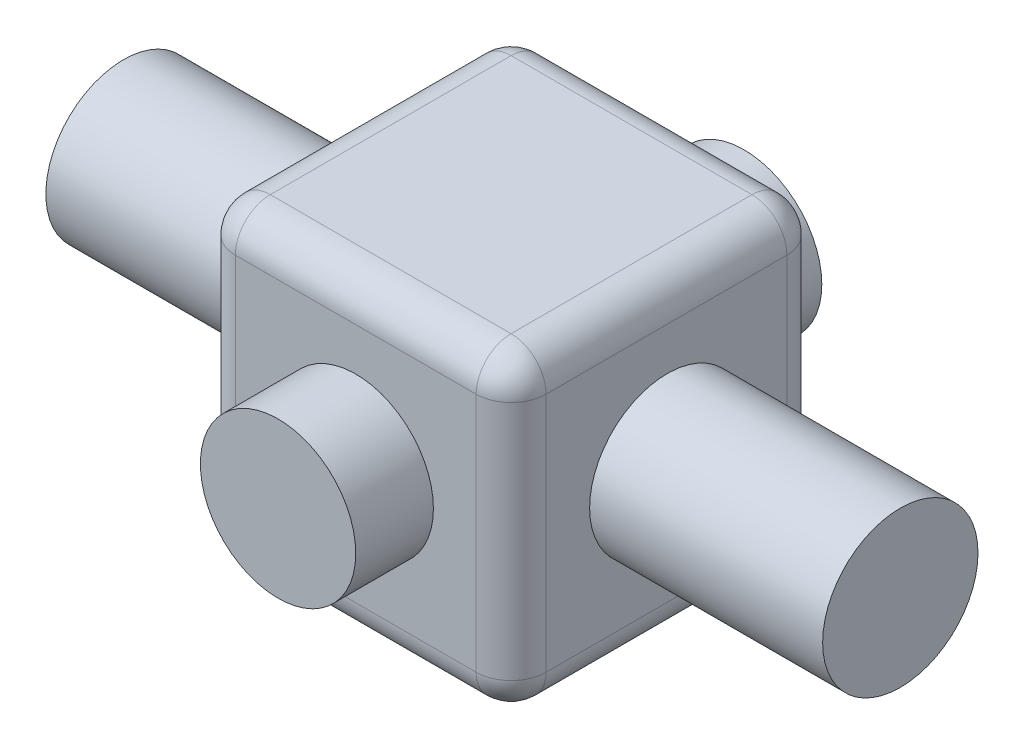
ISO-10303-21;
HEADER;
FILE_DESCRIPTION(('STEP AP214'),'2;1');
FILE_NAME('part.step','',(''),(''),'','','');
FILE_SCHEMA(('AUTOMOTIVE_DESIGN { 1 0 10303 214 1 1 1 1 }'));
ENDSEC;
DATA;
#1=APPLICATION_CONTEXT('core data for automotive mechanical design processes');
#2=APPLICATION_PROTOCOL_DEFINITION('international standard','automotive_design',2000,#1);
#3=PRODUCT_CONTEXT('',#1,'mechanical');
#4=PRODUCT('Part','Part','',(#3));
#5=PRODUCT_RELATED_PRODUCT_CATEGORY('part','',(#4));
#6=PRODUCT_DEFINITION_FORMATION('','',#4);
#7=PRODUCT_DEFINITION_CONTEXT('part definition',#1,'design');
#8=PRODUCT_DEFINITION('design','',#6,#7);
#9=PRODUCT_DEFINITION_SHAPE('','',#8);
#10=(LENGTH_UNIT() NAMED_UNIT(*) SI_UNIT(.MILLI.,.METRE.));
#11=(NAMED_UNIT(*) PLANE_ANGLE_UNIT() SI_UNIT($,.RADIAN.));
#12=(NAMED_UNIT(*) SI_UNIT($,.STERADIAN.) SOLID_ANGLE_UNIT());
#13=UNCERTAINTY_MEASURE_WITH_UNIT(LENGTH_MEASURE(1.E-05),#10,'distance_accuracy_value','');
#14=(GEOMETRIC_REPRESENTATION_CONTEXT(3) GLOBAL_UNCERTAINTY_ASSIGNED_CONTEXT((#13)) GLOBAL_UNIT_ASSIGNED_CONTEXT((#10,
#11,#12)) REPRESENTATION_CONTEXT('',''));
#15=CARTESIAN_POINT('',(0.,0.,0.));
#16=DIRECTION('',(0.,0.,1.));
#17=DIRECTION('',(1.,0.,0.));
#18=AXIS2_PLACEMENT_3D('',#15,#16,#17);
#19=CARTESIAN_POINT('',(-4.,-4.,8.));
#20=DIRECTION('',(1.,0.,0.));
#21=DIRECTION('',(0.,0.,-1.));
#22=AXIS2_PLACEMENT_3D('',#19,#20,#21);
#23=PLANE('',#22);
#24=CARTESIAN_POINT('',(-4.,0.,3.97860922663378));
#25=DIRECTION('',(1.,0.,0.));
#26=DIRECTION('',(0.,0.,-1.));
#27=AXIS2_PLACEMENT_3D('',#24,#25,#26);
#28=CIRCLE('',#27,2.);
#29=CARTESIAN_POINT('',(-4.,0.,1.97860922663377));
#30=VERTEX_POINT('',#29);
#31=EDGE_CURVE('E11',#30,#30,#28,.F.);
#32=ORIENTED_EDGE('',*,*,#31,.F.);
#33=EDGE_LOOP('',(#32));
#34=FACE_BOUND('',#33,.T.);
#35=DIRECTION('',(0.,0.,-1.));
#36=VECTOR('',#35,1.);
#37=CARTESIAN_POINT('',(-4.,3.1,8.));
#38=LINE('',#37,#36);
#39=CARTESIAN_POINT('',(-4.,3.1,7.1));
#40=VERTEX_POINT('',#39);
#41=CARTESIAN_POINT('',(-4.,3.1,0.9));
#42=VERTEX_POINT('',#41);
#43=EDGE_CURVE('E173',#40,#42,#38,.T.);
#44=ORIENTED_EDGE('',*,*,#43,.T.);
#45=DIRECTION('',(0.,-1.,0.));
#46=VECTOR('',#45,1.);
#47=CARTESIAN_POINT('',(-4.,-4.,0.9));
#48=LINE('',#47,#46);
#49=CARTESIAN_POINT('',(-4.,-3.1,0.9));
#50=VERTEX_POINT('',#49);
#51=EDGE_CURVE('E175',#42,#50,#48,.T.);
#52=ORIENTED_EDGE('',*,*,#51,.T.);
#53=DIRECTION('',(0.,0.,-1.));
#54=VECTOR('',#53,1.);
#55=CARTESIAN_POINT('',(-4.,-3.1,8.));
#56=LINE('',#55,#54);
#57=CARTESIAN_POINT('',(-4.,-3.1,7.1));
#58=VERTEX_POINT('',#57);
#59=EDGE_CURVE('E171',#50,#58,#56,.F.);
#60=ORIENTED_EDGE('',*,*,#59,.T.);
#61=DIRECTION('',(0.,-1.,0.));
#62=VECTOR('',#61,1.);
#63=CARTESIAN_POINT('',(-4.,4.,7.1));
#64=LINE('',#63,#62);
#65=EDGE_CURVE('E169',#58,#40,#64,.F.);
#66=ORIENTED_EDGE('',*,*,#65,.T.);
#67=EDGE_LOOP('',(#44,#52,#60,#66));
#68=FACE_BOUND('',#67,.T.);
#69=ADVANCED_FACE('F35',(#34,#68),#23,.F.);
#70=CARTESIAN_POINT('',(4.,-4.,8.));
#71=DIRECTION('',(0.,1.,0.));
#72=DIRECTION('',(-1.,0.,0.));
#73=AXIS2_PLACEMENT_3D('',#70,#71,#72);
#74=PLANE('',#73);
#75=DIRECTION('',(0.,0.,-1.));
#76=VECTOR('',#75,1.);
#77=CARTESIAN_POINT('',(-3.1,-4.,8.));
#78=LINE('',#77,#76);
#79=CARTESIAN_POINT('',(-3.1,-4.,7.1));
#80=VERTEX_POINT('',#79);
#81=CARTESIAN_POINT('',(-3.1,-4.,0.9));
#82=VERTEX_POINT('',#81);
#83=EDGE_CURVE('E156',#80,#82,#78,.T.);
#84=ORIENTED_EDGE('',*,*,#83,.T.);
#85=DIRECTION('',(1.,0.,0.));
#86=VECTOR('',#85,1.);
#87=CARTESIAN_POINT('',(4.,-4.,0.9));
#88=LINE('',#87,#86);
#89=CARTESIAN_POINT('',(3.1,-4.,0.9));
#90=VERTEX_POINT('',#89);
#91=EDGE_CURVE('E131',#82,#90,#88,.T.);
#92=ORIENTED_EDGE('',*,*,#91,.T.);
#93=DIRECTION('',(0.,0.,-1.));
#94=VECTOR('',#93,1.);
#95=CARTESIAN_POINT('',(3.1,-4.,8.));
#96=LINE('',#95,#94);
#97=CARTESIAN_POINT('',(3.1,-4.,7.1));
#98=VERTEX_POINT('',#97);
#99=EDGE_CURVE('E145',#90,#98,#96,.F.);
#100=ORIENTED_EDGE('',*,*,#99,.T.);
#101=DIRECTION('',(1.,0.,0.));
#102=VECTOR('',#101,1.);
#103=CARTESIAN_POINT('',(-4.,-4.,7.1));
#104=LINE('',#103,#102);
#105=EDGE_CURVE('E151',#98,#80,#104,.F.);
#106=ORIENTED_EDGE('',*,*,#105,.T.);
#107=EDGE_LOOP('',(#84,#92,#100,#106));
#108=FACE_BOUND('',#107,.T.);
#109=ADVANCED_FACE('F154',(#108),#74,.F.);
#110=CARTESIAN_POINT('',(4.,-4.,8.));
#111=DIRECTION('',(-1.,0.,0.));
#112=DIRECTION('',(0.,0.,1.));
#113=AXIS2_PLACEMENT_3D('',#110,#111,#112);
#114=PLANE('',#113);
#115=CARTESIAN_POINT('',(4.,0.,3.97860922663378));
#116=DIRECTION('',(-1.,0.,0.));
#117=DIRECTION('',(0.,0.,1.));
#118=AXIS2_PLACEMENT_3D('',#115,#116,#117);
#119=CIRCLE('',#118,2.);
#120=CARTESIAN_POINT('',(4.,0.,5.97860922663378));
#121=VERTEX_POINT('',#120);
#122=EDGE_CURVE('E39',#121,#121,#119,.F.);
#123=ORIENTED_EDGE('',*,*,#122,.F.);
#124=EDGE_LOOP('',(#123));
#125=FACE_BOUND('',#124,.T.);
#126=DIRECTION('',(0.,1.,0.));
#127=VECTOR('',#126,1.);
#128=CARTESIAN_POINT('',(4.,-4.,7.1));
#129=LINE('',#128,#127);
#130=CARTESIAN_POINT('',(4.,3.1,7.1));
#131=VERTEX_POINT('',#130);
#132=CARTESIAN_POINT('',(4.,-3.1,7.1));
#133=VERTEX_POINT('',#132);
#134=EDGE_CURVE('E196',#131,#133,#129,.F.);
#135=ORIENTED_EDGE('',*,*,#134,.T.);
#136=DIRECTION('',(0.,0.,-1.));
#137=VECTOR('',#136,1.);
#138=CARTESIAN_POINT('',(4.,-3.1,8.));
#139=LINE('',#138,#137);
#140=CARTESIAN_POINT('',(4.,-3.1,0.9));
#141=VERTEX_POINT('',#140);
#142=EDGE_CURVE('E201',#133,#141,#139,.T.);
#143=ORIENTED_EDGE('',*,*,#142,.T.);
#144=DIRECTION('',(0.,1.,0.));
#145=VECTOR('',#144,1.);
#146=CARTESIAN_POINT('',(4.,-4.,0.9));
#147=LINE('',#146,#145);
#148=CARTESIAN_POINT('',(4.,3.1,0.9));
#149=VERTEX_POINT('',#148);
#150=EDGE_CURVE('E59',#141,#149,#147,.T.);
#151=ORIENTED_EDGE('',*,*,#150,.T.);
#152=DIRECTION('',(0.,0.,-1.));
#153=VECTOR('',#152,1.);
#154=CARTESIAN_POINT('',(4.,3.1,8.));
#155=LINE('',#154,#153);
#156=EDGE_CURVE('E198',#149,#131,#155,.F.);
#157=ORIENTED_EDGE('',*,*,#156,.T.);
#158=EDGE_LOOP('',(#135,#143,#151,#157));
#159=FACE_BOUND('',#158,.T.);
#160=ADVANCED_FACE('F301',(#125,#159),#114,.F.);
#161=CARTESIAN_POINT('',(4.,4.,8.));
#162=DIRECTION('',(0.,-1.,0.));
#163=DIRECTION('',(1.,0.,0.));
#164=AXIS2_PLACEMENT_3D('',#161,#162,#163);
#165=PLANE('',#164);
#166=DIRECTION('',(-1.,0.,0.));
#167=VECTOR('',#166,1.);
#168=CARTESIAN_POINT('',(4.,4.,0.9));
#169=LINE('',#168,#167);
#170=CARTESIAN_POINT('',(3.1,4.,0.9));
#171=VERTEX_POINT('',#170);
#172=CARTESIAN_POINT('',(-3.1,4.,0.9));
#173=VERTEX_POINT('',#172);
#174=EDGE_CURVE('E182',#171,#173,#169,.T.);
#175=ORIENTED_EDGE('',*,*,#174,.T.);
#176=DIRECTION('',(0.,0.,-1.));
#177=VECTOR('',#176,1.);
#178=CARTESIAN_POINT('',(-3.1,4.,8.));
#179=LINE('',#178,#177);
#180=CARTESIAN_POINT('',(-3.1,4.,7.1));
#181=VERTEX_POINT('',#180);
#182=EDGE_CURVE('E184',#173,#181,#179,.F.);
#183=ORIENTED_EDGE('',*,*,#182,.T.);
#184=DIRECTION('',(-1.,0.,0.));
#185=VECTOR('',#184,1.);
#186=CARTESIAN_POINT('',(4.,4.,7.1));
#187=LINE('',#186,#185);
#188=CARTESIAN_POINT('',(3.1,4.,7.1));
#189=VERTEX_POINT('',#188);
#190=EDGE_CURVE('E180',#181,#189,#187,.F.);
#191=ORIENTED_EDGE('',*,*,#190,.T.);
#192=DIRECTION('',(0.,0.,-1.));
#193=VECTOR('',#192,1.);
#194=CARTESIAN_POINT('',(3.1,4.,8.));
#195=LINE('',#194,#193);
#196=EDGE_CURVE('E178',#189,#171,#195,.T.);
#197=ORIENTED_EDGE('',*,*,#196,.T.);
#198=EDGE_LOOP('',(#175,#183,#191,#197));
#199=FACE_BOUND('',#198,.T.);
#200=ADVANCED_FACE('F576',(#199),#165,.F.);
#201=CARTESIAN_POINT('',(0.,0.,8.));
#202=DIRECTION('',(0.,0.,1.));
#203=DIRECTION('',(1.,0.,0.));
#204=AXIS2_PLACEMENT_3D('',#201,#202,#203);
#205=PLANE('',#204);
#206=CARTESIAN_POINT('',(0.,0.,8.));
#207=DIRECTION('',(0.,0.,1.));
#208=DIRECTION('',(1.,0.,0.));
#209=AXIS2_PLACEMENT_3D('',#206,#207,#208);
#210=CIRCLE('',#209,2.);
#211=CARTESIAN_POINT('',(2.,0.,8.));
#212=VERTEX_POINT('',#211);
#213=EDGE_CURVE('E202',#212,#212,#210,.T.);
#214=ORIENTED_EDGE('',*,*,#213,.F.);
#215=EDGE_LOOP('',(#214));
#216=FACE_BOUND('',#215,.T.);
#217=DIRECTION('',(0.,-1.,0.));
#218=VECTOR('',#217,1.);
#219=CARTESIAN_POINT('',(-3.1,-4.,8.));
#220=LINE('',#219,#218);
#221=CARTESIAN_POINT('',(-3.1,3.1,8.));
#222=VERTEX_POINT('',#221);
#223=CARTESIAN_POINT('',(-3.1,-3.1,8.));
#224=VERTEX_POINT('',#223);
#225=EDGE_CURVE('E191',#222,#224,#220,.T.);
#226=ORIENTED_EDGE('',*,*,#225,.T.);
#227=DIRECTION('',(1.,0.,0.));
#228=VECTOR('',#227,1.);
#229=CARTESIAN_POINT('',(4.,-3.1,8.));
#230=LINE('',#229,#228);
#231=CARTESIAN_POINT('',(3.1,-3.1,8.));
#232=VERTEX_POINT('',#231);
#233=EDGE_CURVE('E193',#224,#232,#230,.T.);
#234=ORIENTED_EDGE('',*,*,#233,.T.);
#235=DIRECTION('',(0.,1.,0.));
#236=VECTOR('',#235,1.);
#237=CARTESIAN_POINT('',(3.1,4.,8.));
#238=LINE('',#237,#236);
#239=CARTESIAN_POINT('',(3.1,3.1,8.));
#240=VERTEX_POINT('',#239);
#241=EDGE_CURVE('E187',#232,#240,#238,.T.);
#242=ORIENTED_EDGE('',*,*,#241,.T.);
#243=DIRECTION('',(-1.,0.,0.));
#244=VECTOR('',#243,1.);
#245=CARTESIAN_POINT('',(-4.,3.1,8.));
#246=LINE('',#245,#244);
#247=EDGE_CURVE('E189',#240,#222,#246,.T.);
#248=ORIENTED_EDGE('',*,*,#247,.T.);
#249=EDGE_LOOP('',(#226,#234,#242,#248));
#250=FACE_BOUND('',#249,.T.);
#251=ADVANCED_FACE('F569',(#216,#250),#205,.T.);
#252=CARTESIAN_POINT('',(0.,0.,0.));
#253=DIRECTION('',(0.,0.,1.));
#254=DIRECTION('',(1.,0.,0.));
#255=AXIS2_PLACEMENT_3D('',#252,#253,#254);
#256=PLANE('',#255);
#257=CARTESIAN_POINT('',(0.,0.,0.));
#258=DIRECTION('',(0.,0.,1.));
#259=DIRECTION('',(1.,0.,0.));
#260=AXIS2_PLACEMENT_3D('',#257,#258,#259);
#261=CIRCLE('',#260,2.);
#262=CARTESIAN_POINT('',(2.,0.,0.));
#263=VERTEX_POINT('',#262);
#264=EDGE_CURVE('E135',#263,#263,#261,.T.);
#265=ORIENTED_EDGE('',*,*,#264,.T.);
#266=EDGE_LOOP('',(#265));
#267=FACE_BOUND('',#266,.T.);
#268=DIRECTION('',(0.,1.,0.));
#269=VECTOR('',#268,1.);
#270=CARTESIAN_POINT('',(3.1,0.,0.));
#271=LINE('',#270,#269);
#272=CARTESIAN_POINT('',(3.1,3.1,0.));
#273=VERTEX_POINT('',#272);
#274=CARTESIAN_POINT('',(3.1,-3.1,0.));
#275=VERTEX_POINT('',#274);
#276=EDGE_CURVE('E158',#273,#275,#271,.F.);
#277=ORIENTED_EDGE('',*,*,#276,.T.);
#278=DIRECTION('',(1.,0.,0.));
#279=VECTOR('',#278,1.);
#280=CARTESIAN_POINT('',(0.,-3.1,0.));
#281=LINE('',#280,#279);
#282=CARTESIAN_POINT('',(-3.1,-3.1,0.));
#283=VERTEX_POINT('',#282);
#284=EDGE_CURVE('E133',#275,#283,#281,.F.);
#285=ORIENTED_EDGE('',*,*,#284,.T.);
#286=DIRECTION('',(0.,-1.,0.));
#287=VECTOR('',#286,1.);
#288=CARTESIAN_POINT('',(-3.1,0.,0.));
#289=LINE('',#288,#287);
#290=CARTESIAN_POINT('',(-3.1,3.1,0.));
#291=VERTEX_POINT('',#290);
#292=EDGE_CURVE('E166',#283,#291,#289,.F.);
#293=ORIENTED_EDGE('',*,*,#292,.T.);
#294=DIRECTION('',(-1.,0.,0.));
#295=VECTOR('',#294,1.);
#296=CARTESIAN_POINT('',(0.,3.1,0.));
#297=LINE('',#296,#295);
#298=EDGE_CURVE('E160',#291,#273,#297,.F.);
#299=ORIENTED_EDGE('',*,*,#298,.T.);
#300=EDGE_LOOP('',(#277,#285,#293,#299));
#301=FACE_BOUND('',#300,.T.);
#302=ADVANCED_FACE('F295',(#267,#301),#256,.F.);
#303=CARTESIAN_POINT('',(0.,3.1,7.1));
#304=DIRECTION('',(1.,0.,0.));
#305=DIRECTION('',(0.,1.,0.));
#306=AXIS2_PLACEMENT_3D('',#303,#304,#305);
#307=CYLINDRICAL_SURFACE('',#306,0.9);
#308=CARTESIAN_POINT('',(-3.1,3.1,7.1));
#309=DIRECTION('',(-1.,0.,0.));
#310=DIRECTION('',(0.,0.,1.));
#311=AXIS2_PLACEMENT_3D('',#308,#309,#310);
#312=CIRCLE('',#311,0.9);
#313=EDGE_CURVE('E152',#222,#181,#312,.T.);
#314=ORIENTED_EDGE('',*,*,#313,.F.);
#315=ORIENTED_EDGE('',*,*,#247,.F.);
#316=CARTESIAN_POINT('',(3.1,3.1,7.1));
#317=DIRECTION('',(1.,0.,0.));
#318=DIRECTION('',(0.,0.,-1.));
#319=AXIS2_PLACEMENT_3D('',#316,#317,#318);
#320=CIRCLE('',#319,0.9);
#321=EDGE_CURVE('E254',#189,#240,#320,.T.);
#322=ORIENTED_EDGE('',*,*,#321,.F.);
#323=ORIENTED_EDGE('',*,*,#190,.F.);
#324=EDGE_LOOP('',(#314,#315,#322,#323));
#325=FACE_BOUND('',#324,.T.);
#326=ADVANCED_FACE('F37',(#325),#307,.T.);
#327=CARTESIAN_POINT('',(-3.1,3.1,7.1));
#328=DIRECTION('',(0.,0.,1.));
#329=DIRECTION('',(1.,0.,0.));
#330=AXIS2_PLACEMENT_3D('',#327,#328,#329);
#331=SPHERICAL_SURFACE('',#330,0.9);
#332=CARTESIAN_POINT('',(-3.1,3.1,7.1));
#333=DIRECTION('',(0.,1.,0.));
#334=DIRECTION('',(0.,0.,1.));
#335=AXIS2_PLACEMENT_3D('',#332,#333,#334);
#336=CIRCLE('',#335,0.9);
#337=EDGE_CURVE('E249',#222,#40,#336,.F.);
#338=ORIENTED_EDGE('',*,*,#337,.F.);
#339=ORIENTED_EDGE('',*,*,#313,.T.);
#340=CARTESIAN_POINT('',(-3.1,3.1,7.1));
#341=DIRECTION('',(0.,0.,1.));
#342=DIRECTION('',(1.,0.,0.));
#343=AXIS2_PLACEMENT_3D('',#340,#341,#342);
#344=CIRCLE('',#343,0.9);
#345=EDGE_CURVE('E252',#40,#181,#344,.F.);
#346=ORIENTED_EDGE('',*,*,#345,.F.);
#347=EDGE_LOOP('',(#338,#339,#346));
#348=FACE_BOUND('',#347,.T.);
#349=ADVANCED_FACE('F546',(#348),#331,.T.);
#350=CARTESIAN_POINT('',(3.1,3.1,7.1));
#351=DIRECTION('',(0.,0.,1.));
#352=DIRECTION('',(1.,0.,0.));
#353=AXIS2_PLACEMENT_3D('',#350,#351,#352);
#354=SPHERICAL_SURFACE('',#353,0.9);
#355=CARTESIAN_POINT('',(3.1,3.1,7.1));
#356=DIRECTION('',(0.,0.,1.));
#357=DIRECTION('',(1.,0.,0.));
#358=AXIS2_PLACEMENT_3D('',#355,#356,#357);
#359=CIRCLE('',#358,0.9);
#360=EDGE_CURVE('E243',#189,#131,#359,.F.);
#361=ORIENTED_EDGE('',*,*,#360,.F.);
#362=ORIENTED_EDGE('',*,*,#321,.T.);
#363=CARTESIAN_POINT('',(3.1,3.1,7.1));
#364=DIRECTION('',(0.,1.,0.));
#365=DIRECTION('',(0.,0.,1.));
#366=AXIS2_PLACEMENT_3D('',#363,#364,#365);
#367=CIRCLE('',#366,0.9);
#368=EDGE_CURVE('E246',#131,#240,#367,.F.);
#369=ORIENTED_EDGE('',*,*,#368,.F.);
#370=EDGE_LOOP('',(#361,#362,#369));
#371=FACE_BOUND('',#370,.T.);
#372=ADVANCED_FACE('F537',(#371),#354,.T.);
#373=CARTESIAN_POINT('',(-3.1,3.1,8.));
#374=DIRECTION('',(0.,0.,-1.));
#375=DIRECTION('',(-1.,0.,0.));
#376=AXIS2_PLACEMENT_3D('',#373,#374,#375);
#377=CYLINDRICAL_SURFACE('',#376,0.9);
#378=ORIENTED_EDGE('',*,*,#345,.T.);
#379=ORIENTED_EDGE('',*,*,#182,.F.);
#380=CARTESIAN_POINT('',(-3.1,3.1,0.9));
#381=DIRECTION('',(0.,0.,-1.));
#382=DIRECTION('',(-1.,0.,0.));
#383=AXIS2_PLACEMENT_3D('',#380,#381,#382);
#384=CIRCLE('',#383,0.9);
#385=EDGE_CURVE('E237',#42,#173,#384,.T.);
#386=ORIENTED_EDGE('',*,*,#385,.F.);
#387=ORIENTED_EDGE('',*,*,#43,.F.);
#388=EDGE_LOOP('',(#378,#379,#386,#387));
#389=FACE_BOUND('',#388,.T.);
#390=ADVANCED_FACE('F528',(#389),#377,.T.);
#391=CARTESIAN_POINT('',(-3.1,0.,7.1));
#392=DIRECTION('',(0.,1.,0.));
#393=DIRECTION('',(0.,0.,1.));
#394=AXIS2_PLACEMENT_3D('',#391,#392,#393);
#395=CYLINDRICAL_SURFACE('',#394,0.9);
#396=ORIENTED_EDGE('',*,*,#337,.T.);
#397=ORIENTED_EDGE('',*,*,#65,.F.);
#398=CARTESIAN_POINT('',(-3.1,-3.1,7.1));
#399=DIRECTION('',(0.,-1.,0.));
#400=DIRECTION('',(0.,0.,-1.));
#401=AXIS2_PLACEMENT_3D('',#398,#399,#400);
#402=CIRCLE('',#401,0.9);
#403=EDGE_CURVE('E234',#224,#58,#402,.T.);
#404=ORIENTED_EDGE('',*,*,#403,.F.);
#405=ORIENTED_EDGE('',*,*,#225,.F.);
#406=EDGE_LOOP('',(#396,#397,#404,#405));
#407=FACE_BOUND('',#406,.T.);
#408=ADVANCED_FACE('F520',(#407),#395,.T.);
#409=CARTESIAN_POINT('',(0.,-3.1,7.1));
#410=DIRECTION('',(-1.,0.,0.));
#411=DIRECTION('',(0.,-1.,0.));
#412=AXIS2_PLACEMENT_3D('',#409,#410,#411);
#413=CYLINDRICAL_SURFACE('',#412,0.9);
#414=CARTESIAN_POINT('',(3.1,-3.1,7.1));
#415=DIRECTION('',(1.,0.,0.));
#416=DIRECTION('',(0.,0.,-1.));
#417=AXIS2_PLACEMENT_3D('',#414,#415,#416);
#418=CIRCLE('',#417,0.9);
#419=EDGE_CURVE('E228',#232,#98,#418,.T.);
#420=ORIENTED_EDGE('',*,*,#419,.F.);
#421=ORIENTED_EDGE('',*,*,#233,.F.);
#422=CARTESIAN_POINT('',(-3.1,-3.1,7.1));
#423=DIRECTION('',(-1.,0.,0.));
#424=DIRECTION('',(0.,0.,1.));
#425=AXIS2_PLACEMENT_3D('',#422,#423,#424);
#426=CIRCLE('',#425,0.9);
#427=EDGE_CURVE('E231',#80,#224,#426,.T.);
#428=ORIENTED_EDGE('',*,*,#427,.F.);
#429=ORIENTED_EDGE('',*,*,#105,.F.);
#430=EDGE_LOOP('',(#420,#421,#428,#429));
#431=FACE_BOUND('',#430,.T.);
#432=ADVANCED_FACE('F277',(#431),#413,.T.);
#433=CARTESIAN_POINT('',(3.1,0.,7.1));
#434=DIRECTION('',(0.,-1.,0.));
#435=DIRECTION('',(0.,0.,-1.));
#436=AXIS2_PLACEMENT_3D('',#433,#434,#435);
#437=CYLINDRICAL_SURFACE('',#436,0.9);
#438=ORIENTED_EDGE('',*,*,#368,.T.);
#439=ORIENTED_EDGE('',*,*,#241,.F.);
#440=CARTESIAN_POINT('',(3.1,-3.1,7.1));
#441=DIRECTION('',(0.,-1.,0.));
#442=DIRECTION('',(0.,0.,-1.));
#443=AXIS2_PLACEMENT_3D('',#440,#441,#442);
#444=CIRCLE('',#443,0.9);
#445=EDGE_CURVE('E226',#133,#232,#444,.T.);
#446=ORIENTED_EDGE('',*,*,#445,.F.);
#447=ORIENTED_EDGE('',*,*,#134,.F.);
#448=EDGE_LOOP('',(#438,#439,#446,#447));
#449=FACE_BOUND('',#448,.T.);
#450=ADVANCED_FACE('F306',(#449),#437,.T.);
#451=CARTESIAN_POINT('',(3.1,3.1,8.));
#452=DIRECTION('',(0.,0.,-1.));
#453=DIRECTION('',(-1.,0.,0.));
#454=AXIS2_PLACEMENT_3D('',#451,#452,#453);
#455=CYLINDRICAL_SURFACE('',#454,0.9);
#456=ORIENTED_EDGE('',*,*,#360,.T.);
#457=ORIENTED_EDGE('',*,*,#156,.F.);
#458=CARTESIAN_POINT('',(3.1,3.1,0.9));
#459=DIRECTION('',(0.,0.,-1.));
#460=DIRECTION('',(-1.,0.,0.));
#461=AXIS2_PLACEMENT_3D('',#458,#459,#460);
#462=CIRCLE('',#461,0.9);
#463=EDGE_CURVE('E223',#171,#149,#462,.T.);
#464=ORIENTED_EDGE('',*,*,#463,.F.);
#465=ORIENTED_EDGE('',*,*,#196,.F.);
#466=EDGE_LOOP('',(#456,#457,#464,#465));
#467=FACE_BOUND('',#466,.T.);
#468=ADVANCED_FACE('F496',(#467),#455,.T.);
#469=CARTESIAN_POINT('',(4.,3.1,0.9));
#470=DIRECTION('',(-1.,0.,0.));
#471=DIRECTION('',(0.,-1.,0.));
#472=AXIS2_PLACEMENT_3D('',#469,#470,#471);
#473=CYLINDRICAL_SURFACE('',#472,0.9);
#474=CARTESIAN_POINT('',(-3.1,3.1,0.9));
#475=DIRECTION('',(-1.,0.,0.));
#476=DIRECTION('',(0.,0.,1.));
#477=AXIS2_PLACEMENT_3D('',#474,#475,#476);
#478=CIRCLE('',#477,0.9);
#479=EDGE_CURVE('E240',#173,#291,#478,.T.);
#480=ORIENTED_EDGE('',*,*,#479,.F.);
#481=ORIENTED_EDGE('',*,*,#174,.F.);
#482=CARTESIAN_POINT('',(3.1,3.1,0.9));
#483=DIRECTION('',(1.,0.,0.));
#484=DIRECTION('',(0.,0.,-1.));
#485=AXIS2_PLACEMENT_3D('',#482,#483,#484);
#486=CIRCLE('',#485,0.9);
#487=EDGE_CURVE('E220',#273,#171,#486,.T.);
#488=ORIENTED_EDGE('',*,*,#487,.F.);
#489=ORIENTED_EDGE('',*,*,#298,.F.);
#490=EDGE_LOOP('',(#480,#481,#488,#489));
#491=FACE_BOUND('',#490,.T.);
#492=ADVANCED_FACE('F487',(#491),#473,.T.);
#493=CARTESIAN_POINT('',(-3.1,3.1,0.9));
#494=DIRECTION('',(0.,0.,1.));
#495=DIRECTION('',(1.,0.,0.));
#496=AXIS2_PLACEMENT_3D('',#493,#494,#495);
#497=SPHERICAL_SURFACE('',#496,0.9);
#498=ORIENTED_EDGE('',*,*,#385,.T.);
#499=ORIENTED_EDGE('',*,*,#479,.T.);
#500=CARTESIAN_POINT('',(-3.1,3.1,0.9));
#501=DIRECTION('',(0.,1.,0.));
#502=DIRECTION('',(0.,0.,1.));
#503=AXIS2_PLACEMENT_3D('',#500,#501,#502);
#504=CIRCLE('',#503,0.9);
#505=EDGE_CURVE('E217',#42,#291,#504,.F.);
#506=ORIENTED_EDGE('',*,*,#505,.F.);
#507=EDGE_LOOP('',(#498,#499,#506));
#508=FACE_BOUND('',#507,.T.);
#509=ADVANCED_FACE('F318',(#508),#497,.T.);
#510=CARTESIAN_POINT('',(-3.1,-3.1,7.1));
#511=DIRECTION('',(0.,0.,1.));
#512=DIRECTION('',(1.,0.,0.));
#513=AXIS2_PLACEMENT_3D('',#510,#511,#512);
#514=SPHERICAL_SURFACE('',#513,0.9);
#515=ORIENTED_EDGE('',*,*,#427,.T.);
#516=ORIENTED_EDGE('',*,*,#403,.T.);
#517=CARTESIAN_POINT('',(-3.1,-3.1,7.1));
#518=DIRECTION('',(0.,0.,1.));
#519=DIRECTION('',(1.,0.,0.));
#520=AXIS2_PLACEMENT_3D('',#517,#518,#519);
#521=CIRCLE('',#520,0.9);
#522=EDGE_CURVE('E214',#80,#58,#521,.F.);
#523=ORIENTED_EDGE('',*,*,#522,.F.);
#524=EDGE_LOOP('',(#515,#516,#523));
#525=FACE_BOUND('',#524,.T.);
#526=ADVANCED_FACE('F280',(#525),#514,.T.);
#527=CARTESIAN_POINT('',(3.1,-3.1,7.1));
#528=DIRECTION('',(0.,0.,1.));
#529=DIRECTION('',(1.,0.,0.));
#530=AXIS2_PLACEMENT_3D('',#527,#528,#529);
#531=SPHERICAL_SURFACE('',#530,0.9);
#532=ORIENTED_EDGE('',*,*,#445,.T.);
#533=ORIENTED_EDGE('',*,*,#419,.T.);
#534=CARTESIAN_POINT('',(3.1,-3.1,7.1));
#535=DIRECTION('',(0.,0.,1.));
#536=DIRECTION('',(1.,0.,0.));
#537=AXIS2_PLACEMENT_3D('',#534,#535,#536);
#538=CIRCLE('',#537,0.9);
#539=EDGE_CURVE('E148',#133,#98,#538,.F.);
#540=ORIENTED_EDGE('',*,*,#539,.F.);
#541=EDGE_LOOP('',(#532,#533,#540));
#542=FACE_BOUND('',#541,.T.);
#543=ADVANCED_FACE('F308',(#542),#531,.T.);
#544=CARTESIAN_POINT('',(3.1,3.1,0.9));
#545=DIRECTION('',(0.,0.,1.));
#546=DIRECTION('',(1.,0.,0.));
#547=AXIS2_PLACEMENT_3D('',#544,#545,#546);
#548=SPHERICAL_SURFACE('',#547,0.9);
#549=ORIENTED_EDGE('',*,*,#487,.T.);
#550=ORIENTED_EDGE('',*,*,#463,.T.);
#551=CARTESIAN_POINT('',(3.1,3.1,0.9));
#552=DIRECTION('',(0.,1.,0.));
#553=DIRECTION('',(0.,0.,1.));
#554=AXIS2_PLACEMENT_3D('',#551,#552,#553);
#555=CIRCLE('',#554,0.9);
#556=EDGE_CURVE('E210',#273,#149,#555,.F.);
#557=ORIENTED_EDGE('',*,*,#556,.F.);
#558=EDGE_LOOP('',(#549,#550,#557));
#559=FACE_BOUND('',#558,.T.);
#560=ADVANCED_FACE('F310',(#559),#548,.T.);
#561=CARTESIAN_POINT('',(-3.1,-4.,0.9));
#562=DIRECTION('',(0.,-1.,0.));
#563=DIRECTION('',(0.,0.,-1.));
#564=AXIS2_PLACEMENT_3D('',#561,#562,#563);
#565=CYLINDRICAL_SURFACE('',#564,0.9);
#566=ORIENTED_EDGE('',*,*,#505,.T.);
#567=ORIENTED_EDGE('',*,*,#292,.F.);
#568=CARTESIAN_POINT('',(-3.1,-3.1,0.9));
#569=DIRECTION('',(0.,-1.,0.));
#570=DIRECTION('',(0.,0.,-1.));
#571=AXIS2_PLACEMENT_3D('',#568,#569,#570);
#572=CIRCLE('',#571,0.9);
#573=EDGE_CURVE('E207',#50,#283,#572,.T.);
#574=ORIENTED_EDGE('',*,*,#573,.F.);
#575=ORIENTED_EDGE('',*,*,#51,.F.);
#576=EDGE_LOOP('',(#566,#567,#574,#575));
#577=FACE_BOUND('',#576,.T.);
#578=ADVANCED_FACE('F291',(#577),#565,.T.);
#579=CARTESIAN_POINT('',(-3.1,-3.1,8.));
#580=DIRECTION('',(0.,0.,-1.));
#581=DIRECTION('',(-1.,0.,0.));
#582=AXIS2_PLACEMENT_3D('',#579,#580,#581);
#583=CYLINDRICAL_SURFACE('',#582,0.9);
#584=ORIENTED_EDGE('',*,*,#522,.T.);
#585=ORIENTED_EDGE('',*,*,#59,.F.);
#586=CARTESIAN_POINT('',(-3.1,-3.1,0.9));
#587=DIRECTION('',(0.,0.,-1.));
#588=DIRECTION('',(-1.,0.,0.));
#589=AXIS2_PLACEMENT_3D('',#586,#587,#588);
#590=CIRCLE('',#589,0.9);
#591=EDGE_CURVE('E142',#82,#50,#590,.T.);
#592=ORIENTED_EDGE('',*,*,#591,.F.);
#593=ORIENTED_EDGE('',*,*,#83,.F.);
#594=EDGE_LOOP('',(#584,#585,#592,#593));
#595=FACE_BOUND('',#594,.T.);
#596=ADVANCED_FACE('F283',(#595),#583,.T.);
#597=CARTESIAN_POINT('',(3.1,-3.1,8.));
#598=DIRECTION('',(0.,0.,-1.));
#599=DIRECTION('',(-1.,0.,0.));
#600=AXIS2_PLACEMENT_3D('',#597,#598,#599);
#601=CYLINDRICAL_SURFACE('',#600,0.9);
#602=ORIENTED_EDGE('',*,*,#539,.T.);
#603=ORIENTED_EDGE('',*,*,#99,.F.);
#604=CARTESIAN_POINT('',(3.1,-3.1,0.9));
#605=DIRECTION('',(0.,0.,-1.));
#606=DIRECTION('',(-1.,0.,0.));
#607=AXIS2_PLACEMENT_3D('',#604,#605,#606);
#608=CIRCLE('',#607,0.9);
#609=EDGE_CURVE('E137',#141,#90,#608,.T.);
#610=ORIENTED_EDGE('',*,*,#609,.F.);
#611=ORIENTED_EDGE('',*,*,#142,.F.);
#612=EDGE_LOOP('',(#602,#603,#610,#611));
#613=FACE_BOUND('',#612,.T.);
#614=ADVANCED_FACE('F146',(#613),#601,.T.);
#615=CARTESIAN_POINT('',(3.1,-4.,0.9));
#616=DIRECTION('',(0.,1.,0.));
#617=DIRECTION('',(0.,0.,1.));
#618=AXIS2_PLACEMENT_3D('',#615,#616,#617);
#619=CYLINDRICAL_SURFACE('',#618,0.9);
#620=ORIENTED_EDGE('',*,*,#556,.T.);
#621=ORIENTED_EDGE('',*,*,#150,.F.);
#622=CARTESIAN_POINT('',(3.1,-3.1,0.9));
#623=DIRECTION('',(0.,-1.,0.));
#624=DIRECTION('',(0.,0.,-1.));
#625=AXIS2_PLACEMENT_3D('',#622,#623,#624);
#626=CIRCLE('',#625,0.9);
#627=EDGE_CURVE('E51',#275,#141,#626,.T.);
#628=ORIENTED_EDGE('',*,*,#627,.F.);
#629=ORIENTED_EDGE('',*,*,#276,.F.);
#630=EDGE_LOOP('',(#620,#621,#628,#629));
#631=FACE_BOUND('',#630,.T.);
#632=ADVANCED_FACE('F299',(#631),#619,.T.);
#633=CARTESIAN_POINT('',(-3.1,-3.1,0.9));
#634=DIRECTION('',(0.,0.,1.));
#635=DIRECTION('',(1.,0.,0.));
#636=AXIS2_PLACEMENT_3D('',#633,#634,#635);
#637=SPHERICAL_SURFACE('',#636,0.9);
#638=ORIENTED_EDGE('',*,*,#591,.T.);
#639=ORIENTED_EDGE('',*,*,#573,.T.);
#640=CARTESIAN_POINT('',(-3.1,-3.1,0.9));
#641=DIRECTION('',(-1.,0.,0.));
#642=DIRECTION('',(0.,0.,1.));
#643=AXIS2_PLACEMENT_3D('',#640,#641,#642);
#644=CIRCLE('',#643,0.9);
#645=EDGE_CURVE('E134',#82,#283,#644,.F.);
#646=ORIENTED_EDGE('',*,*,#645,.F.);
#647=EDGE_LOOP('',(#638,#639,#646));
#648=FACE_BOUND('',#647,.T.);
#649=ADVANCED_FACE('F287',(#648),#637,.T.);
#650=CARTESIAN_POINT('',(3.1,-3.1,0.9));
#651=DIRECTION('',(0.,0.,1.));
#652=DIRECTION('',(1.,0.,0.));
#653=AXIS2_PLACEMENT_3D('',#650,#651,#652);
#654=SPHERICAL_SURFACE('',#653,0.9);
#655=ORIENTED_EDGE('',*,*,#627,.T.);
#656=ORIENTED_EDGE('',*,*,#609,.T.);
#657=CARTESIAN_POINT('',(3.1,-3.1,0.9));
#658=DIRECTION('',(1.,0.,0.));
#659=DIRECTION('',(0.,0.,-1.));
#660=AXIS2_PLACEMENT_3D('',#657,#658,#659);
#661=CIRCLE('',#660,0.9);
#662=EDGE_CURVE('E128',#275,#90,#661,.F.);
#663=ORIENTED_EDGE('',*,*,#662,.F.);
#664=EDGE_LOOP('',(#655,#656,#663));
#665=FACE_BOUND('',#664,.T.);
#666=ADVANCED_FACE('F139',(#665),#654,.T.);
#667=CARTESIAN_POINT('',(4.,-3.1,0.9));
#668=DIRECTION('',(1.,0.,0.));
#669=DIRECTION('',(0.,1.,0.));
#670=AXIS2_PLACEMENT_3D('',#667,#668,#669);
#671=CYLINDRICAL_SURFACE('',#670,0.9);
#672=ORIENTED_EDGE('',*,*,#645,.T.);
#673=ORIENTED_EDGE('',*,*,#284,.F.);
#674=ORIENTED_EDGE('',*,*,#662,.T.);
#675=ORIENTED_EDGE('',*,*,#91,.F.);
#676=EDGE_LOOP('',(#672,#673,#674,#675));
#677=FACE_BOUND('',#676,.T.);
#678=ADVANCED_FACE('F129',(#677),#671,.T.);
#679=CARTESIAN_POINT('',(0.,0.,-2.));
#680=DIRECTION('',(0.,0.,1.));
#681=DIRECTION('',(1.,0.,0.));
#682=AXIS2_PLACEMENT_3D('',#679,#680,#681);
#683=PLANE('',#682);
#684=CARTESIAN_POINT('',(0.,0.,-2.));
#685=DIRECTION('',(0.,0.,1.));
#686=DIRECTION('',(1.,0.,0.));
#687=AXIS2_PLACEMENT_3D('',#684,#685,#686);
#688=CIRCLE('',#687,2.);
#689=CARTESIAN_POINT('',(2.,0.,-2.));
#690=VERTEX_POINT('',#689);
#691=EDGE_CURVE('E259',#690,#690,#688,.T.);
#692=ORIENTED_EDGE('',*,*,#691,.F.);
#693=EDGE_LOOP('',(#692));
#694=FACE_BOUND('',#693,.T.);
#695=ADVANCED_FACE('F333',(#694),#683,.F.);
#696=CARTESIAN_POINT('',(0.,0.,-2.));
#697=DIRECTION('',(0.,0.,1.));
#698=DIRECTION('',(1.,0.,0.));
#699=AXIS2_PLACEMENT_3D('',#696,#697,#698);
#700=CYLINDRICAL_SURFACE('',#699,2.);
#701=ORIENTED_EDGE('',*,*,#691,.T.);
#702=EDGE_LOOP('',(#701));
#703=FACE_BOUND('',#702,.T.);
#704=ORIENTED_EDGE('',*,*,#264,.F.);
#705=EDGE_LOOP('',(#704));
#706=FACE_BOUND('',#705,.T.);
#707=ADVANCED_FACE('F380',(#703,#706),#700,.T.);
#708=ORIENTED_EDGE('',*,*,#213,.T.);
#709=EDGE_LOOP('',(#708));
#710=FACE_BOUND('',#709,.T.);
#711=CARTESIAN_POINT('',(0.,0.,10.));
#712=DIRECTION('',(0.,0.,1.));
#713=DIRECTION('',(1.,0.,0.));
#714=AXIS2_PLACEMENT_3D('',#711,#712,#713);
#715=CIRCLE('',#714,2.);
#716=CARTESIAN_POINT('',(2.,0.,10.));
#717=VERTEX_POINT('',#716);
#718=EDGE_CURVE('E263',#717,#717,#715,.T.);
#719=ORIENTED_EDGE('',*,*,#718,.F.);
#720=EDGE_LOOP('',(#719));
#721=FACE_BOUND('',#720,.T.);
#722=ADVANCED_FACE('F389',(#710,#721),#700,.T.);
#723=CARTESIAN_POINT('',(0.,0.,10.));
#724=DIRECTION('',(0.,0.,1.));
#725=DIRECTION('',(1.,0.,0.));
#726=AXIS2_PLACEMENT_3D('',#723,#724,#725);
#727=PLANE('',#726);
#728=ORIENTED_EDGE('',*,*,#718,.T.);
#729=EDGE_LOOP('',(#728));
#730=FACE_BOUND('',#729,.T.);
#731=ADVANCED_FACE('F396',(#730),#727,.T.);
#732=CARTESIAN_POINT('',(10.,0.,3.97860922663378));
#733=DIRECTION('',(1.,0.,0.));
#734=DIRECTION('',(0.,0.,-1.));
#735=AXIS2_PLACEMENT_3D('',#732,#733,#734);
#736=PLANE('',#735);
#737=CARTESIAN_POINT('',(10.,0.,3.97860922663378));
#738=DIRECTION('',(1.,0.,0.));
#739=DIRECTION('',(0.,0.,-1.));
#740=AXIS2_PLACEMENT_3D('',#737,#738,#739);
#741=CIRCLE('',#740,2.);
#742=CARTESIAN_POINT('',(10.,0.,1.97860922663377));
#743=VERTEX_POINT('',#742);
#744=EDGE_CURVE('E268',#743,#743,#741,.T.);
#745=ORIENTED_EDGE('',*,*,#744,.T.);
#746=EDGE_LOOP('',(#745));
#747=FACE_BOUND('',#746,.T.);
#748=ADVANCED_FACE('F403',(#747),#736,.T.);
#749=CARTESIAN_POINT('',(10.,0.,3.97860922663378));
#750=DIRECTION('',(-1.,0.,0.));
#751=DIRECTION('',(0.,0.,1.));
#752=AXIS2_PLACEMENT_3D('',#749,#750,#751);
#753=CYLINDRICAL_SURFACE('',#752,2.);
#754=ORIENTED_EDGE('',*,*,#744,.F.);
#755=EDGE_LOOP('',(#754));
#756=FACE_BOUND('',#755,.T.);
#757=ORIENTED_EDGE('',*,*,#122,.T.);
#758=EDGE_LOOP('',(#757));
#759=FACE_BOUND('',#758,.T.);
#760=ADVANCED_FACE('F411',(#756,#759),#753,.T.);
#761=CARTESIAN_POINT('',(-10.,0.,3.97860922663378));
#762=DIRECTION('',(1.,0.,0.));
#763=DIRECTION('',(0.,0.,-1.));
#764=AXIS2_PLACEMENT_3D('',#761,#762,#763);
#765=CIRCLE('',#764,2.);
#766=CARTESIAN_POINT('',(-10.,0.,1.97860922663377));
#767=VERTEX_POINT('',#766);
#768=EDGE_CURVE('E643',#767,#767,#765,.T.);
#769=ORIENTED_EDGE('',*,*,#768,.T.);
#770=EDGE_LOOP('',(#769));
#771=FACE_BOUND('',#770,.T.);
#772=ORIENTED_EDGE('',*,*,#31,.T.);
#773=EDGE_LOOP('',(#772));
#774=FACE_BOUND('',#773,.T.);
#775=ADVANCED_FACE('F420',(#771,#774),#753,.T.);
#776=CARTESIAN_POINT('',(-10.,0.,3.97860922663378));
#777=DIRECTION('',(1.,0.,0.));
#778=DIRECTION('',(0.,0.,-1.));
#779=AXIS2_PLACEMENT_3D('',#776,#777,#778);
#780=PLANE('',#779);
#781=ORIENTED_EDGE('',*,*,#768,.F.);
#782=EDGE_LOOP('',(#781));
#783=FACE_BOUND('',#782,.T.);
#784=ADVANCED_FACE('F428',(#783),#780,.F.);
#785=CLOSED_SHELL('',(#69,#109,#160,#200,#251,#302,#326,#349,#372,#390,#408,#432,#450,#468,#492,
#509,#526,#543,#560,#578,#596,#614,#632,#649,#666,#678,#695,#707,#722,#731,#748,#760,#775,#784));
#786=MANIFOLD_SOLID_BREP('B2',#785);
#787=ADVANCED_BREP_SHAPE_REPRESENTATION('',(#18,#786),#14);
#788=SHAPE_DEFINITION_REPRESENTATION(#9,#787);
ENDSEC;
END-ISO-10303-21;
